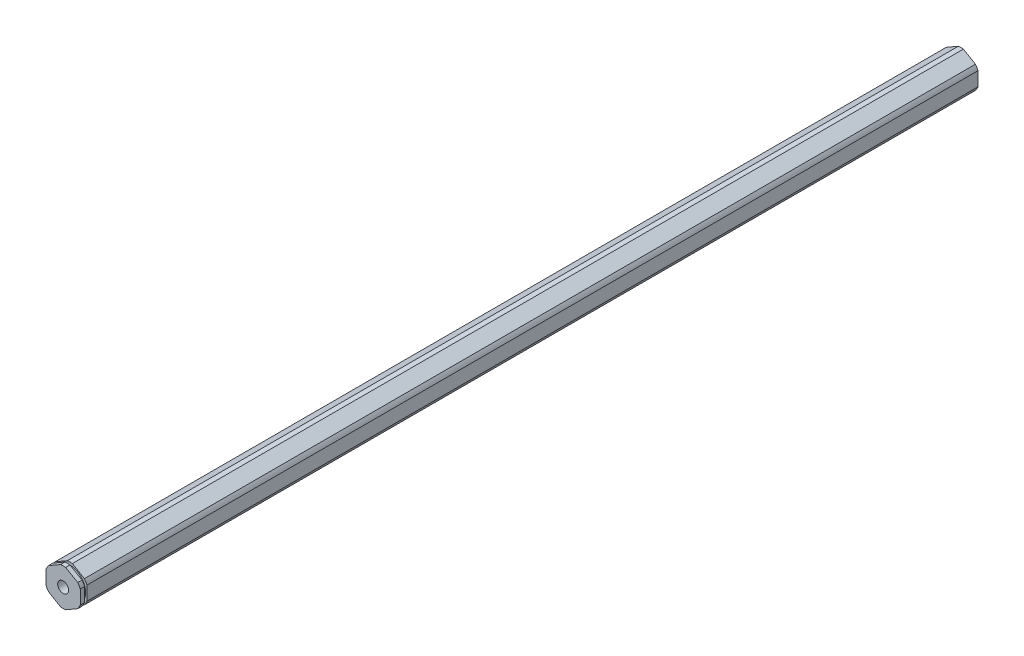
ISO-10303-21;
HEADER;
FILE_DESCRIPTION(('STEP AP214'),'2;1');
FILE_NAME('part.step','',(''),(''),'','','');
FILE_SCHEMA(('AUTOMOTIVE_DESIGN { 1 0 10303 214 1 1 1 1 }'));
ENDSEC;
DATA;
#1=APPLICATION_CONTEXT('core data for automotive mechanical design processes');
#2=APPLICATION_PROTOCOL_DEFINITION('international standard','automotive_design',2000,#1);
#3=PRODUCT_CONTEXT('',#1,'mechanical');
#4=PRODUCT('Part','Part','',(#3));
#5=PRODUCT_RELATED_PRODUCT_CATEGORY('part','',(#4));
#6=PRODUCT_DEFINITION_FORMATION('','',#4);
#7=PRODUCT_DEFINITION_CONTEXT('part definition',#1,'design');
#8=PRODUCT_DEFINITION('design','',#6,#7);
#9=PRODUCT_DEFINITION_SHAPE('','',#8);
#10=(LENGTH_UNIT() NAMED_UNIT(*) SI_UNIT(.MILLI.,.METRE.));
#11=(NAMED_UNIT(*) PLANE_ANGLE_UNIT() SI_UNIT($,.RADIAN.));
#12=(NAMED_UNIT(*) SI_UNIT($,.STERADIAN.) SOLID_ANGLE_UNIT());
#13=UNCERTAINTY_MEASURE_WITH_UNIT(LENGTH_MEASURE(1.E-05),#10,'distance_accuracy_value','');
#14=(GEOMETRIC_REPRESENTATION_CONTEXT(3) GLOBAL_UNCERTAINTY_ASSIGNED_CONTEXT((#13)) GLOBAL_UNIT_ASSIGNED_CONTEXT((#10,
#11,#12)) REPRESENTATION_CONTEXT('',''));
#15=CARTESIAN_POINT('',(0.,0.,0.));
#16=DIRECTION('',(0.,0.,1.));
#17=DIRECTION('',(1.,0.,0.));
#18=AXIS2_PLACEMENT_3D('',#15,#16,#17);
#19=CARTESIAN_POINT('',(6.35,0.,166.33825));
#20=DIRECTION('',(-1.,0.,0.));
#21=DIRECTION('',(0.,-1.,0.));
#22=AXIS2_PLACEMENT_3D('',#19,#20,#21);
#23=PLANE('',#22);
#24=DIRECTION('',(0.,-1.,0.));
#25=VECTOR('',#24,1.);
#26=CARTESIAN_POINT('',(6.35,0.,164.75075));
#27=LINE('',#26,#25);
#28=CARTESIAN_POINT('',(6.35,2.59030191290513,164.75075));
#29=VERTEX_POINT('',#28);
#30=CARTESIAN_POINT('',(6.35,-2.59030191290513,164.75075));
#31=VERTEX_POINT('',#30);
#32=EDGE_CURVE('E74',#29,#31,#27,.T.);
#33=ORIENTED_EDGE('',*,*,#32,.F.);
#34=DIRECTION('',(0.,0.,-1.));
#35=VECTOR('',#34,1.);
#36=CARTESIAN_POINT('',(6.35,2.59030191290513,166.33825));
#37=LINE('',#36,#35);
#38=CARTESIAN_POINT('',(6.35,2.59030191290513,166.33825));
#39=VERTEX_POINT('',#38);
#40=EDGE_CURVE('E242',#39,#29,#37,.T.);
#41=ORIENTED_EDGE('',*,*,#40,.F.);
#42=DIRECTION('',(0.,1.,0.));
#43=VECTOR('',#42,1.);
#44=CARTESIAN_POINT('',(6.35,0.,166.33825));
#45=LINE('',#44,#43);
#46=CARTESIAN_POINT('',(6.35,-2.59030191290513,166.33825));
#47=VERTEX_POINT('',#46);
#48=EDGE_CURVE('E330',#47,#39,#45,.T.);
#49=ORIENTED_EDGE('',*,*,#48,.F.);
#50=DIRECTION('',(0.,0.,-1.));
#51=VECTOR('',#50,1.);
#52=CARTESIAN_POINT('',(6.35,-2.59030191290513,166.33825));
#53=LINE('',#52,#51);
#54=EDGE_CURVE('E285',#47,#31,#53,.T.);
#55=ORIENTED_EDGE('',*,*,#54,.T.);
#56=EDGE_LOOP('',(#33,#41,#49,#55));
#57=FACE_BOUND('',#56,.T.);
#58=ADVANCED_FACE('F53',(#57),#23,.F.);
#59=CARTESIAN_POINT('',(0.,0.,166.33825));
#60=DIRECTION('',(0.,0.,-1.));
#61=DIRECTION('',(-1.,0.,0.));
#62=AXIS2_PLACEMENT_3D('',#59,#60,#61);
#63=CYLINDRICAL_SURFACE('',#62,6.858);
#64=CARTESIAN_POINT('',(0.,0.,164.75075));
#65=DIRECTION('',(0.,0.,1.));
#66=DIRECTION('',(1.,0.,0.));
#67=AXIS2_PLACEMENT_3D('',#64,#65,#66);
#68=CIRCLE('',#67,6.858);
#69=CARTESIAN_POINT('',(5.41826726004727,4.20411035757862,164.75075));
#70=VERTEX_POINT('',#69);
#71=EDGE_CURVE('E367',#29,#70,#68,.T.);
#72=ORIENTED_EDGE('',*,*,#71,.T.);
#73=DIRECTION('',(0.,0.,-1.));
#74=VECTOR('',#73,1.);
#75=CARTESIAN_POINT('',(5.41826726004727,4.20411035757862,166.33825));
#76=LINE('',#75,#74);
#77=CARTESIAN_POINT('',(5.41826726004727,4.20411035757862,166.33825));
#78=VERTEX_POINT('',#77);
#79=EDGE_CURVE('E243',#78,#70,#76,.T.);
#80=ORIENTED_EDGE('',*,*,#79,.F.);
#81=CARTESIAN_POINT('',(0.,0.,166.33825));
#82=DIRECTION('',(0.,0.,1.));
#83=DIRECTION('',(1.,0.,0.));
#84=AXIS2_PLACEMENT_3D('',#81,#82,#83);
#85=CIRCLE('',#84,6.858);
#86=EDGE_CURVE('E328',#39,#78,#85,.T.);
#87=ORIENTED_EDGE('',*,*,#86,.F.);
#88=ORIENTED_EDGE('',*,*,#40,.T.);
#89=EDGE_LOOP('',(#72,#80,#87,#88));
#90=FACE_BOUND('',#89,.T.);
#91=ADVANCED_FACE('F456',(#90),#63,.T.);
#92=CARTESIAN_POINT('',(3.175,5.49926131403119,166.33825));
#93=DIRECTION('',(-0.5,-0.866025403784439,0.));
#94=DIRECTION('',(0.866025403784439,-0.5,0.));
#95=AXIS2_PLACEMENT_3D('',#92,#93,#94);
#96=PLANE('',#95);
#97=DIRECTION('',(0.866025403784439,-0.5,0.));
#98=VECTOR('',#97,1.);
#99=CARTESIAN_POINT('',(3.175,5.49926131403119,164.75075));
#100=LINE('',#99,#98);
#101=CARTESIAN_POINT('',(0.931732739952733,6.79441227048375,164.75075));
#102=VERTEX_POINT('',#101);
#103=EDGE_CURVE('E345',#102,#70,#100,.T.);
#104=ORIENTED_EDGE('',*,*,#103,.F.);
#105=DIRECTION('',(0.,0.,-1.));
#106=VECTOR('',#105,1.);
#107=CARTESIAN_POINT('',(0.931732739952733,6.79441227048375,166.33825));
#108=LINE('',#107,#106);
#109=CARTESIAN_POINT('',(0.931732739952733,6.79441227048375,166.33825));
#110=VERTEX_POINT('',#109);
#111=EDGE_CURVE('E249',#110,#102,#108,.T.);
#112=ORIENTED_EDGE('',*,*,#111,.F.);
#113=DIRECTION('',(-0.866025403784439,0.5,0.));
#114=VECTOR('',#113,1.);
#115=CARTESIAN_POINT('',(3.175,5.49926131403119,166.33825));
#116=LINE('',#115,#114);
#117=EDGE_CURVE('E326',#78,#110,#116,.T.);
#118=ORIENTED_EDGE('',*,*,#117,.F.);
#119=ORIENTED_EDGE('',*,*,#79,.T.);
#120=EDGE_LOOP('',(#104,#112,#118,#119));
#121=FACE_BOUND('',#120,.T.);
#122=ADVANCED_FACE('F466',(#121),#96,.F.);
#123=CARTESIAN_POINT('',(-0.931732739952722,6.79441227048375,164.75075));
#124=VERTEX_POINT('',#123);
#125=EDGE_CURVE('E369',#102,#124,#68,.T.);
#126=ORIENTED_EDGE('',*,*,#125,.T.);
#127=DIRECTION('',(0.,0.,-1.));
#128=VECTOR('',#127,1.);
#129=CARTESIAN_POINT('',(-0.931732739952731,6.79441227048375,166.33825));
#130=LINE('',#129,#128);
#131=CARTESIAN_POINT('',(-0.931732739952731,6.79441227048375,166.33825));
#132=VERTEX_POINT('',#131);
#133=EDGE_CURVE('E253',#132,#124,#130,.T.);
#134=ORIENTED_EDGE('',*,*,#133,.F.);
#135=EDGE_CURVE('E325',#110,#132,#85,.T.);
#136=ORIENTED_EDGE('',*,*,#135,.F.);
#137=ORIENTED_EDGE('',*,*,#111,.T.);
#138=EDGE_LOOP('',(#126,#134,#136,#137));
#139=FACE_BOUND('',#138,.T.);
#140=ADVANCED_FACE('F471',(#139),#63,.T.);
#141=CARTESIAN_POINT('',(-3.175,5.49926131403119,166.33825));
#142=DIRECTION('',(0.5,-0.866025403784438,0.));
#143=DIRECTION('',(0.866025403784439,0.5,0.));
#144=AXIS2_PLACEMENT_3D('',#141,#142,#143);
#145=PLANE('',#144);
#146=DIRECTION('',(0.866025403784439,0.5,0.));
#147=VECTOR('',#146,1.);
#148=CARTESIAN_POINT('',(-3.175,5.49926131403119,164.75075));
#149=LINE('',#148,#147);
#150=CARTESIAN_POINT('',(-5.41826726004727,4.20411035757862,164.75075));
#151=VERTEX_POINT('',#150);
#152=EDGE_CURVE('E347',#151,#124,#149,.T.);
#153=ORIENTED_EDGE('',*,*,#152,.F.);
#154=DIRECTION('',(0.,0.,-1.));
#155=VECTOR('',#154,1.);
#156=CARTESIAN_POINT('',(-5.41826726004727,4.20411035757862,166.33825));
#157=LINE('',#156,#155);
#158=CARTESIAN_POINT('',(-5.41826726004727,4.20411035757862,166.33825));
#159=VERTEX_POINT('',#158);
#160=EDGE_CURVE('E257',#159,#151,#157,.T.);
#161=ORIENTED_EDGE('',*,*,#160,.F.);
#162=DIRECTION('',(-0.866025403784439,-0.5,0.));
#163=VECTOR('',#162,1.);
#164=CARTESIAN_POINT('',(-3.175,5.49926131403119,166.33825));
#165=LINE('',#164,#163);
#166=EDGE_CURVE('E323',#132,#159,#165,.T.);
#167=ORIENTED_EDGE('',*,*,#166,.F.);
#168=ORIENTED_EDGE('',*,*,#133,.T.);
#169=EDGE_LOOP('',(#153,#161,#167,#168));
#170=FACE_BOUND('',#169,.T.);
#171=ADVANCED_FACE('F477',(#170),#145,.F.);
#172=CARTESIAN_POINT('',(-6.35,2.59030191290514,164.75075));
#173=VERTEX_POINT('',#172);
#174=EDGE_CURVE('E375',#151,#173,#68,.T.);
#175=ORIENTED_EDGE('',*,*,#174,.T.);
#176=DIRECTION('',(0.,0.,-1.));
#177=VECTOR('',#176,1.);
#178=CARTESIAN_POINT('',(-6.35,2.59030191290514,166.33825));
#179=LINE('',#178,#177);
#180=CARTESIAN_POINT('',(-6.35,2.59030191290514,166.33825));
#181=VERTEX_POINT('',#180);
#182=EDGE_CURVE('E261',#181,#173,#179,.T.);
#183=ORIENTED_EDGE('',*,*,#182,.F.);
#184=EDGE_CURVE('E322',#159,#181,#85,.T.);
#185=ORIENTED_EDGE('',*,*,#184,.F.);
#186=ORIENTED_EDGE('',*,*,#160,.T.);
#187=EDGE_LOOP('',(#175,#183,#185,#186));
#188=FACE_BOUND('',#187,.T.);
#189=ADVANCED_FACE('F386',(#188),#63,.T.);
#190=CARTESIAN_POINT('',(-6.35,0.,166.33825));
#191=DIRECTION('',(1.,0.,0.));
#192=DIRECTION('',(0.,1.,0.));
#193=AXIS2_PLACEMENT_3D('',#190,#191,#192);
#194=PLANE('',#193);
#195=DIRECTION('',(0.,1.,0.));
#196=VECTOR('',#195,1.);
#197=CARTESIAN_POINT('',(-6.35,0.,164.75075));
#198=LINE('',#197,#196);
#199=CARTESIAN_POINT('',(-6.35,-2.59030191290514,164.75075));
#200=VERTEX_POINT('',#199);
#201=EDGE_CURVE('E349',#200,#173,#198,.T.);
#202=ORIENTED_EDGE('',*,*,#201,.F.);
#203=DIRECTION('',(0.,0.,-1.));
#204=VECTOR('',#203,1.);
#205=CARTESIAN_POINT('',(-6.35,-2.59030191290514,166.33825));
#206=LINE('',#205,#204);
#207=CARTESIAN_POINT('',(-6.35,-2.59030191290514,166.33825));
#208=VERTEX_POINT('',#207);
#209=EDGE_CURVE('E265',#208,#200,#206,.T.);
#210=ORIENTED_EDGE('',*,*,#209,.F.);
#211=DIRECTION('',(0.,-1.,0.));
#212=VECTOR('',#211,1.);
#213=CARTESIAN_POINT('',(-6.35,0.,166.33825));
#214=LINE('',#213,#212);
#215=EDGE_CURVE('E320',#181,#208,#214,.T.);
#216=ORIENTED_EDGE('',*,*,#215,.F.);
#217=ORIENTED_EDGE('',*,*,#182,.T.);
#218=EDGE_LOOP('',(#202,#210,#216,#217));
#219=FACE_BOUND('',#218,.T.);
#220=ADVANCED_FACE('F393',(#219),#194,.F.);
#221=CARTESIAN_POINT('',(-5.41826726004728,-4.20411035757861,164.75075));
#222=VERTEX_POINT('',#221);
#223=EDGE_CURVE('E377',#200,#222,#68,.T.);
#224=ORIENTED_EDGE('',*,*,#223,.T.);
#225=DIRECTION('',(0.,0.,-1.));
#226=VECTOR('',#225,1.);
#227=CARTESIAN_POINT('',(-5.41826726004728,-4.20411035757862,166.33825));
#228=LINE('',#227,#226);
#229=CARTESIAN_POINT('',(-5.41826726004728,-4.20411035757862,166.33825));
#230=VERTEX_POINT('',#229);
#231=EDGE_CURVE('E269',#230,#222,#228,.T.);
#232=ORIENTED_EDGE('',*,*,#231,.F.);
#233=EDGE_CURVE('E319',#208,#230,#85,.T.);
#234=ORIENTED_EDGE('',*,*,#233,.F.);
#235=ORIENTED_EDGE('',*,*,#209,.T.);
#236=EDGE_LOOP('',(#224,#232,#234,#235));
#237=FACE_BOUND('',#236,.T.);
#238=ADVANCED_FACE('F497',(#237),#63,.T.);
#239=CARTESIAN_POINT('',(-3.175,-5.49926131403118,166.33825));
#240=DIRECTION('',(0.5,0.866025403784439,0.));
#241=DIRECTION('',(-0.866025403784439,0.5,0.));
#242=AXIS2_PLACEMENT_3D('',#239,#240,#241);
#243=PLANE('',#242);
#244=DIRECTION('',(-0.866025403784439,0.5,0.));
#245=VECTOR('',#244,1.);
#246=CARTESIAN_POINT('',(-3.175,-5.49926131403118,164.75075));
#247=LINE('',#246,#245);
#248=CARTESIAN_POINT('',(-0.931732739952721,-6.79441227048375,164.75075));
#249=VERTEX_POINT('',#248);
#250=EDGE_CURVE('E351',#249,#222,#247,.T.);
#251=ORIENTED_EDGE('',*,*,#250,.F.);
#252=DIRECTION('',(0.,0.,-1.));
#253=VECTOR('',#252,1.);
#254=CARTESIAN_POINT('',(-0.931732739952721,-6.79441227048375,166.33825));
#255=LINE('',#254,#253);
#256=CARTESIAN_POINT('',(-0.931732739952721,-6.79441227048375,166.33825));
#257=VERTEX_POINT('',#256);
#258=EDGE_CURVE('E273',#257,#249,#255,.T.);
#259=ORIENTED_EDGE('',*,*,#258,.F.);
#260=DIRECTION('',(0.866025403784439,-0.5,0.));
#261=VECTOR('',#260,1.);
#262=CARTESIAN_POINT('',(-3.175,-5.49926131403118,166.33825));
#263=LINE('',#262,#261);
#264=EDGE_CURVE('E317',#230,#257,#263,.T.);
#265=ORIENTED_EDGE('',*,*,#264,.F.);
#266=ORIENTED_EDGE('',*,*,#231,.T.);
#267=EDGE_LOOP('',(#251,#259,#265,#266));
#268=FACE_BOUND('',#267,.T.);
#269=ADVANCED_FACE('F507',(#268),#243,.F.);
#270=CARTESIAN_POINT('',(0.931732739952728,-6.79441227048375,164.75075));
#271=VERTEX_POINT('',#270);
#272=EDGE_CURVE('E370',#249,#271,#68,.T.);
#273=ORIENTED_EDGE('',*,*,#272,.T.);
#274=DIRECTION('',(0.,0.,-1.));
#275=VECTOR('',#274,1.);
#276=CARTESIAN_POINT('',(0.931732739952731,-6.79441227048375,166.33825));
#277=LINE('',#276,#275);
#278=CARTESIAN_POINT('',(0.931732739952731,-6.79441227048375,166.33825));
#279=VERTEX_POINT('',#278);
#280=EDGE_CURVE('E277',#279,#271,#277,.T.);
#281=ORIENTED_EDGE('',*,*,#280,.F.);
#282=EDGE_CURVE('E316',#257,#279,#85,.T.);
#283=ORIENTED_EDGE('',*,*,#282,.F.);
#284=ORIENTED_EDGE('',*,*,#258,.T.);
#285=EDGE_LOOP('',(#273,#281,#283,#284));
#286=FACE_BOUND('',#285,.T.);
#287=ADVANCED_FACE('F455',(#286),#63,.T.);
#288=CARTESIAN_POINT('',(3.175,-5.49926131403118,166.33825));
#289=DIRECTION('',(-0.5,0.866025403784439,0.));
#290=DIRECTION('',(-0.866025403784439,-0.5,0.));
#291=AXIS2_PLACEMENT_3D('',#288,#289,#290);
#292=PLANE('',#291);
#293=DIRECTION('',(-0.866025403784439,-0.5,0.));
#294=VECTOR('',#293,1.);
#295=CARTESIAN_POINT('',(3.175,-5.49926131403118,164.75075));
#296=LINE('',#295,#294);
#297=CARTESIAN_POINT('',(5.41826726004727,-4.20411035757862,164.75075));
#298=VERTEX_POINT('',#297);
#299=EDGE_CURVE('E224',#298,#271,#296,.T.);
#300=ORIENTED_EDGE('',*,*,#299,.F.);
#301=DIRECTION('',(0.,0.,-1.));
#302=VECTOR('',#301,1.);
#303=CARTESIAN_POINT('',(5.41826726004727,-4.20411035757862,166.33825));
#304=LINE('',#303,#302);
#305=CARTESIAN_POINT('',(5.41826726004727,-4.20411035757862,166.33825));
#306=VERTEX_POINT('',#305);
#307=EDGE_CURVE('E281',#306,#298,#304,.T.);
#308=ORIENTED_EDGE('',*,*,#307,.F.);
#309=DIRECTION('',(0.866025403784439,0.5,0.));
#310=VECTOR('',#309,1.);
#311=CARTESIAN_POINT('',(3.175,-5.49926131403118,166.33825));
#312=LINE('',#311,#310);
#313=EDGE_CURVE('E313',#279,#306,#312,.T.);
#314=ORIENTED_EDGE('',*,*,#313,.F.);
#315=ORIENTED_EDGE('',*,*,#280,.T.);
#316=EDGE_LOOP('',(#300,#308,#314,#315));
#317=FACE_BOUND('',#316,.T.);
#318=ADVANCED_FACE('F448',(#317),#292,.F.);
#319=CARTESIAN_POINT('',(0.,0.,164.75075));
#320=DIRECTION('',(0.,0.,-1.));
#321=DIRECTION('',(-1.,0.,0.));
#322=AXIS2_PLACEMENT_3D('',#319,#320,#321);
#323=CIRCLE('',#322,6.858);
#324=EDGE_CURVE('E11',#31,#298,#323,.T.);
#325=ORIENTED_EDGE('',*,*,#324,.F.);
#326=ORIENTED_EDGE('',*,*,#54,.F.);
#327=EDGE_CURVE('E315',#306,#47,#85,.T.);
#328=ORIENTED_EDGE('',*,*,#327,.F.);
#329=ORIENTED_EDGE('',*,*,#307,.T.);
#330=EDGE_LOOP('',(#325,#326,#328,#329));
#331=FACE_BOUND('',#330,.T.);
#332=ADVANCED_FACE('F454',(#331),#63,.T.);
#333=CARTESIAN_POINT('',(0.,0.,166.33825));
#334=DIRECTION('',(0.,0.,1.));
#335=DIRECTION('',(1.,0.,0.));
#336=AXIS2_PLACEMENT_3D('',#333,#334,#335);
#337=PLANE('',#336);
#338=CARTESIAN_POINT('',(0.,0.,166.33825));
#339=DIRECTION('',(0.,0.,1.));
#340=DIRECTION('',(1.,0.,0.));
#341=AXIS2_PLACEMENT_3D('',#338,#339,#340);
#342=CIRCLE('',#341,2.01929999999999);
#343=CARTESIAN_POINT('',(2.01929999999999,0.,166.33825));
#344=VERTEX_POINT('',#343);
#345=EDGE_CURVE('E341',#344,#344,#342,.T.);
#346=ORIENTED_EDGE('',*,*,#345,.F.);
#347=EDGE_LOOP('',(#346));
#348=FACE_BOUND('',#347,.T.);
#349=ORIENTED_EDGE('',*,*,#48,.T.);
#350=ORIENTED_EDGE('',*,*,#86,.T.);
#351=ORIENTED_EDGE('',*,*,#117,.T.);
#352=ORIENTED_EDGE('',*,*,#135,.T.);
#353=ORIENTED_EDGE('',*,*,#166,.T.);
#354=ORIENTED_EDGE('',*,*,#184,.T.);
#355=ORIENTED_EDGE('',*,*,#215,.T.);
#356=ORIENTED_EDGE('',*,*,#233,.T.);
#357=ORIENTED_EDGE('',*,*,#264,.T.);
#358=ORIENTED_EDGE('',*,*,#282,.T.);
#359=ORIENTED_EDGE('',*,*,#313,.T.);
#360=ORIENTED_EDGE('',*,*,#327,.T.);
#361=EDGE_LOOP('',(#349,#350,#351,#352,#353,#354,#355,#356,#357,#358,#359,#360));
#362=FACE_BOUND('',#361,.T.);
#363=ADVANCED_FACE('F397',(#348,#362),#337,.T.);
#364=CARTESIAN_POINT('',(0.,0.,149.99081));
#365=DIRECTION('',(0.,0.,1.));
#366=DIRECTION('',(1.,0.,0.));
#367=AXIS2_PLACEMENT_3D('',#364,#365,#366);
#368=CONICAL_SURFACE('',#367,2.01929999999999,1.02974425867665);
#369=CARTESIAN_POINT('',(0.,0.,148.777492151998));
#370=VERTEX_POINT('',#369);
#371=VERTEX_LOOP('',#370);
#372=FACE_BOUND('',#371,.T.);
#373=CARTESIAN_POINT('',(0.,0.,149.99081));
#374=DIRECTION('',(0.,0.,1.));
#375=DIRECTION('',(1.,0.,0.));
#376=AXIS2_PLACEMENT_3D('',#373,#374,#375);
#377=CIRCLE('',#376,2.01929999999999);
#378=CARTESIAN_POINT('',(2.01929999999999,0.,149.99081));
#379=VERTEX_POINT('',#378);
#380=EDGE_CURVE('E338',#379,#379,#377,.T.);
#381=ORIENTED_EDGE('',*,*,#380,.T.);
#382=EDGE_LOOP('',(#381));
#383=FACE_BOUND('',#382,.T.);
#384=ADVANCED_FACE('F575',(#372,#383),#368,.F.);
#385=CARTESIAN_POINT('',(0.,0.,166.33825));
#386=DIRECTION('',(0.,0.,1.));
#387=DIRECTION('',(1.,0.,0.));
#388=AXIS2_PLACEMENT_3D('',#385,#386,#387);
#389=CYLINDRICAL_SURFACE('',#388,2.01929999999999);
#390=ORIENTED_EDGE('',*,*,#380,.F.);
#391=EDGE_LOOP('',(#390));
#392=FACE_BOUND('',#391,.T.);
#393=ORIENTED_EDGE('',*,*,#345,.T.);
#394=EDGE_LOOP('',(#393));
#395=FACE_BOUND('',#394,.T.);
#396=ADVANCED_FACE('F541',(#392,#395),#389,.F.);
#397=CARTESIAN_POINT('',(0.,6.858,164.75075));
#398=DIRECTION('',(0.,0.,-1.));
#399=DIRECTION('',(-1.,0.,0.));
#400=AXIS2_PLACEMENT_3D('',#397,#398,#399);
#401=PLANE('',#400);
#402=CARTESIAN_POINT('',(0.,0.,164.75075));
#403=DIRECTION('',(0.,0.,1.));
#404=DIRECTION('',(1.,0.,0.));
#405=AXIS2_PLACEMENT_3D('',#402,#403,#404);
#406=CIRCLE('',#405,5.8547);
#407=CARTESIAN_POINT('',(5.8547,0.,164.75075));
#408=VERTEX_POINT('',#407);
#409=EDGE_CURVE('E362',#408,#408,#406,.T.);
#410=ORIENTED_EDGE('',*,*,#409,.T.);
#411=EDGE_LOOP('',(#410));
#412=FACE_BOUND('',#411,.T.);
#413=ORIENTED_EDGE('',*,*,#32,.T.);
#414=ORIENTED_EDGE('',*,*,#324,.T.);
#415=ORIENTED_EDGE('',*,*,#299,.T.);
#416=ORIENTED_EDGE('',*,*,#272,.F.);
#417=ORIENTED_EDGE('',*,*,#250,.T.);
#418=ORIENTED_EDGE('',*,*,#223,.F.);
#419=ORIENTED_EDGE('',*,*,#201,.T.);
#420=ORIENTED_EDGE('',*,*,#174,.F.);
#421=ORIENTED_EDGE('',*,*,#152,.T.);
#422=ORIENTED_EDGE('',*,*,#125,.F.);
#423=ORIENTED_EDGE('',*,*,#103,.T.);
#424=ORIENTED_EDGE('',*,*,#71,.F.);
#425=EDGE_LOOP('',(#413,#414,#415,#416,#417,#418,#419,#420,#421,#422,#423,#424));
#426=FACE_BOUND('',#425,.T.);
#427=ADVANCED_FACE('F537',(#412,#426),#401,.T.);
#428=CARTESIAN_POINT('',(0.,6.858,163.86175));
#429=DIRECTION('',(0.,0.,1.));
#430=DIRECTION('',(1.,0.,0.));
#431=AXIS2_PLACEMENT_3D('',#428,#429,#430);
#432=PLANE('',#431);
#433=CARTESIAN_POINT('',(0.,0.,163.86175));
#434=DIRECTION('',(0.,0.,1.));
#435=DIRECTION('',(1.,0.,0.));
#436=AXIS2_PLACEMENT_3D('',#433,#434,#435);
#437=CIRCLE('',#436,5.8547);
#438=CARTESIAN_POINT('',(5.8547,0.,163.86175));
#439=VERTEX_POINT('',#438);
#440=EDGE_CURVE('E234',#439,#439,#437,.T.);
#441=ORIENTED_EDGE('',*,*,#440,.F.);
#442=EDGE_LOOP('',(#441));
#443=FACE_BOUND('',#442,.T.);
#444=DIRECTION('',(0.,1.,0.));
#445=VECTOR('',#444,1.);
#446=CARTESIAN_POINT('',(6.35,0.,163.86175));
#447=LINE('',#446,#445);
#448=CARTESIAN_POINT('',(6.35,-2.59030191290513,163.86175));
#449=VERTEX_POINT('',#448);
#450=CARTESIAN_POINT('',(6.35,2.59030191290513,163.86175));
#451=VERTEX_POINT('',#450);
#452=EDGE_CURVE('E216',#449,#451,#447,.T.);
#453=ORIENTED_EDGE('',*,*,#452,.T.);
#454=CARTESIAN_POINT('',(0.,0.,163.86175));
#455=DIRECTION('',(0.,0.,1.));
#456=DIRECTION('',(1.,0.,0.));
#457=AXIS2_PLACEMENT_3D('',#454,#455,#456);
#458=CIRCLE('',#457,6.858);
#459=CARTESIAN_POINT('',(5.41826726004727,4.20411035757862,163.86175));
#460=VERTEX_POINT('',#459);
#461=EDGE_CURVE('E219',#451,#460,#458,.T.);
#462=ORIENTED_EDGE('',*,*,#461,.T.);
#463=DIRECTION('',(-0.866025403784439,0.5,0.));
#464=VECTOR('',#463,1.);
#465=CARTESIAN_POINT('',(3.175,5.49926131403119,163.86175));
#466=LINE('',#465,#464);
#467=CARTESIAN_POINT('',(0.931732739952733,6.79441227048375,163.86175));
#468=VERTEX_POINT('',#467);
#469=EDGE_CURVE('E225',#460,#468,#466,.T.);
#470=ORIENTED_EDGE('',*,*,#469,.T.);
#471=CARTESIAN_POINT('',(-0.931732739952722,6.79441227048375,163.86175));
#472=VERTEX_POINT('',#471);
#473=EDGE_CURVE('E235',#468,#472,#458,.T.);
#474=ORIENTED_EDGE('',*,*,#473,.T.);
#475=DIRECTION('',(-0.866025403784439,-0.5,0.));
#476=VECTOR('',#475,1.);
#477=CARTESIAN_POINT('',(-3.175,5.49926131403119,163.86175));
#478=LINE('',#477,#476);
#479=CARTESIAN_POINT('',(-5.41826726004727,4.20411035757862,163.86175));
#480=VERTEX_POINT('',#479);
#481=EDGE_CURVE('E355',#472,#480,#478,.T.);
#482=ORIENTED_EDGE('',*,*,#481,.T.);
#483=CARTESIAN_POINT('',(-6.35,2.59030191290514,163.86175));
#484=VERTEX_POINT('',#483);
#485=EDGE_CURVE('E422',#480,#484,#458,.T.);
#486=ORIENTED_EDGE('',*,*,#485,.T.);
#487=DIRECTION('',(0.,-1.,0.));
#488=VECTOR('',#487,1.);
#489=CARTESIAN_POINT('',(-6.35,0.,163.86175));
#490=LINE('',#489,#488);
#491=CARTESIAN_POINT('',(-6.35,-2.59030191290514,163.86175));
#492=VERTEX_POINT('',#491);
#493=EDGE_CURVE('E357',#484,#492,#490,.T.);
#494=ORIENTED_EDGE('',*,*,#493,.T.);
#495=CARTESIAN_POINT('',(-5.41826726004728,-4.20411035757861,163.86175));
#496=VERTEX_POINT('',#495);
#497=EDGE_CURVE('E373',#492,#496,#458,.T.);
#498=ORIENTED_EDGE('',*,*,#497,.T.);
#499=DIRECTION('',(0.866025403784439,-0.5,0.));
#500=VECTOR('',#499,1.);
#501=CARTESIAN_POINT('',(-3.175,-5.49926131403118,163.86175));
#502=LINE('',#501,#500);
#503=CARTESIAN_POINT('',(-0.931732739952721,-6.79441227048375,163.86175));
#504=VERTEX_POINT('',#503);
#505=EDGE_CURVE('E359',#496,#504,#502,.T.);
#506=ORIENTED_EDGE('',*,*,#505,.T.);
#507=CARTESIAN_POINT('',(0.931732739952728,-6.79441227048375,163.86175));
#508=VERTEX_POINT('',#507);
#509=EDGE_CURVE('E237',#504,#508,#458,.T.);
#510=ORIENTED_EDGE('',*,*,#509,.T.);
#511=DIRECTION('',(0.866025403784439,0.5,0.));
#512=VECTOR('',#511,1.);
#513=CARTESIAN_POINT('',(3.175,-5.49926131403118,163.86175));
#514=LINE('',#513,#512);
#515=CARTESIAN_POINT('',(5.41826726004727,-4.20411035757862,163.86175));
#516=VERTEX_POINT('',#515);
#517=EDGE_CURVE('E67',#508,#516,#514,.T.);
#518=ORIENTED_EDGE('',*,*,#517,.T.);
#519=CARTESIAN_POINT('',(0.,0.,163.86175));
#520=DIRECTION('',(0.,0.,1.));
#521=DIRECTION('',(1.,0.,0.));
#522=AXIS2_PLACEMENT_3D('',#519,#520,#521);
#523=CIRCLE('',#522,6.858);
#524=EDGE_CURVE('E60',#516,#449,#523,.T.);
#525=ORIENTED_EDGE('',*,*,#524,.T.);
#526=EDGE_LOOP('',(#453,#462,#470,#474,#482,#486,#494,#498,#506,#510,#518,#525));
#527=FACE_BOUND('',#526,.T.);
#528=ADVANCED_FACE('F218',(#443,#527),#432,.T.);
#529=CARTESIAN_POINT('',(0.,0.,165.047176272324));
#530=DIRECTION('',(0.,0.,1.));
#531=DIRECTION('',(1.,0.,0.));
#532=AXIS2_PLACEMENT_3D('',#529,#530,#531);
#533=CYLINDRICAL_SURFACE('',#532,5.8547);
#534=ORIENTED_EDGE('',*,*,#440,.T.);
#535=EDGE_LOOP('',(#534));
#536=FACE_BOUND('',#535,.T.);
#537=ORIENTED_EDGE('',*,*,#409,.F.);
#538=EDGE_LOOP('',(#537));
#539=FACE_BOUND('',#538,.T.);
#540=ADVANCED_FACE('F551',(#536,#539),#533,.T.);
#541=CARTESIAN_POINT('',(0.,0.,-149.99081));
#542=DIRECTION('',(0.,0.,-1.));
#543=DIRECTION('',(-1.,0.,0.));
#544=AXIS2_PLACEMENT_3D('',#541,#542,#543);
#545=CONICAL_SURFACE('',#544,2.01929999999999,1.02974425867665);
#546=CARTESIAN_POINT('',(0.,0.,-148.777492151998));
#547=VERTEX_POINT('',#546);
#548=VERTEX_LOOP('',#547);
#549=FACE_BOUND('',#548,.T.);
#550=CARTESIAN_POINT('',(0.,0.,-149.99081));
#551=DIRECTION('',(0.,0.,-1.));
#552=DIRECTION('',(-1.,0.,0.));
#553=AXIS2_PLACEMENT_3D('',#550,#551,#552);
#554=CIRCLE('',#553,2.01929999999999);
#555=CARTESIAN_POINT('',(-2.01929999999999,0.,-149.99081));
#556=VERTEX_POINT('',#555);
#557=EDGE_CURVE('E312',#556,#556,#554,.T.);
#558=ORIENTED_EDGE('',*,*,#557,.T.);
#559=EDGE_LOOP('',(#558));
#560=FACE_BOUND('',#559,.T.);
#561=ADVANCED_FACE('F559',(#549,#560),#545,.F.);
#562=CARTESIAN_POINT('',(0.,0.,-166.33825));
#563=DIRECTION('',(0.,0.,-1.));
#564=DIRECTION('',(-1.,0.,0.));
#565=AXIS2_PLACEMENT_3D('',#562,#563,#564);
#566=CYLINDRICAL_SURFACE('',#565,2.01929999999999);
#567=ORIENTED_EDGE('',*,*,#557,.F.);
#568=EDGE_LOOP('',(#567));
#569=FACE_BOUND('',#568,.T.);
#570=CARTESIAN_POINT('',(0.,0.,-166.33825));
#571=DIRECTION('',(0.,0.,-1.));
#572=DIRECTION('',(-1.,0.,0.));
#573=AXIS2_PLACEMENT_3D('',#570,#571,#572);
#574=CIRCLE('',#573,2.01929999999999);
#575=CARTESIAN_POINT('',(-2.01929999999999,0.,-166.33825));
#576=VERTEX_POINT('',#575);
#577=EDGE_CURVE('E335',#576,#576,#574,.T.);
#578=ORIENTED_EDGE('',*,*,#577,.T.);
#579=EDGE_LOOP('',(#578));
#580=FACE_BOUND('',#579,.T.);
#581=ADVANCED_FACE('F589',(#569,#580),#566,.F.);
#582=CARTESIAN_POINT('',(0.,0.,-166.33825));
#583=DIRECTION('',(0.,0.,1.));
#584=DIRECTION('',(1.,0.,0.));
#585=AXIS2_PLACEMENT_3D('',#582,#583,#584);
#586=PLANE('',#585);
#587=ORIENTED_EDGE('',*,*,#577,.F.);
#588=EDGE_LOOP('',(#587));
#589=FACE_BOUND('',#588,.T.);
#590=DIRECTION('',(0.,1.,0.));
#591=VECTOR('',#590,1.);
#592=CARTESIAN_POINT('',(6.35,0.,-166.33825));
#593=LINE('',#592,#591);
#594=CARTESIAN_POINT('',(6.35,-2.59030191290513,-166.33825));
#595=VERTEX_POINT('',#594);
#596=CARTESIAN_POINT('',(6.35,2.59030191290513,-166.33825));
#597=VERTEX_POINT('',#596);
#598=EDGE_CURVE('E241',#595,#597,#593,.T.);
#599=ORIENTED_EDGE('',*,*,#598,.F.);
#600=CARTESIAN_POINT('',(0.,0.,-166.33825));
#601=DIRECTION('',(0.,0.,1.));
#602=DIRECTION('',(1.,0.,0.));
#603=AXIS2_PLACEMENT_3D('',#600,#601,#602);
#604=CIRCLE('',#603,6.858);
#605=CARTESIAN_POINT('',(5.41826726004727,-4.20411035757862,-166.33825));
#606=VERTEX_POINT('',#605);
#607=EDGE_CURVE('E292',#606,#595,#604,.T.);
#608=ORIENTED_EDGE('',*,*,#607,.F.);
#609=DIRECTION('',(0.866025403784439,0.5,0.));
#610=VECTOR('',#609,1.);
#611=CARTESIAN_POINT('',(3.175,-5.49926131403118,-166.33825));
#612=LINE('',#611,#610);
#613=CARTESIAN_POINT('',(0.931732739952731,-6.79441227048375,-166.33825));
#614=VERTEX_POINT('',#613);
#615=EDGE_CURVE('E289',#614,#606,#612,.T.);
#616=ORIENTED_EDGE('',*,*,#615,.F.);
#617=CARTESIAN_POINT('',(-0.931732739952721,-6.79441227048375,-166.33825));
#618=VERTEX_POINT('',#617);
#619=EDGE_CURVE('E293',#618,#614,#604,.T.);
#620=ORIENTED_EDGE('',*,*,#619,.F.);
#621=DIRECTION('',(0.866025403784439,-0.5,0.));
#622=VECTOR('',#621,1.);
#623=CARTESIAN_POINT('',(-3.175,-5.49926131403118,-166.33825));
#624=LINE('',#623,#622);
#625=CARTESIAN_POINT('',(-5.41826726004728,-4.20411035757862,-166.33825));
#626=VERTEX_POINT('',#625);
#627=EDGE_CURVE('E294',#626,#618,#624,.T.);
#628=ORIENTED_EDGE('',*,*,#627,.F.);
#629=CARTESIAN_POINT('',(-6.35,-2.59030191290514,-166.33825));
#630=VERTEX_POINT('',#629);
#631=EDGE_CURVE('E297',#630,#626,#604,.T.);
#632=ORIENTED_EDGE('',*,*,#631,.F.);
#633=DIRECTION('',(0.,-1.,0.));
#634=VECTOR('',#633,1.);
#635=CARTESIAN_POINT('',(-6.35,0.,-166.33825));
#636=LINE('',#635,#634);
#637=CARTESIAN_POINT('',(-6.35,2.59030191290514,-166.33825));
#638=VERTEX_POINT('',#637);
#639=EDGE_CURVE('E298',#638,#630,#636,.T.);
#640=ORIENTED_EDGE('',*,*,#639,.F.);
#641=CARTESIAN_POINT('',(-5.41826726004727,4.20411035757862,-166.33825));
#642=VERTEX_POINT('',#641);
#643=EDGE_CURVE('E301',#642,#638,#604,.T.);
#644=ORIENTED_EDGE('',*,*,#643,.F.);
#645=DIRECTION('',(-0.866025403784439,-0.5,0.));
#646=VECTOR('',#645,1.);
#647=CARTESIAN_POINT('',(-3.175,5.49926131403119,-166.33825));
#648=LINE('',#647,#646);
#649=CARTESIAN_POINT('',(-0.931732739952731,6.79441227048375,-166.33825));
#650=VERTEX_POINT('',#649);
#651=EDGE_CURVE('E302',#650,#642,#648,.T.);
#652=ORIENTED_EDGE('',*,*,#651,.F.);
#653=CARTESIAN_POINT('',(0.931732739952733,6.79441227048375,-166.33825));
#654=VERTEX_POINT('',#653);
#655=EDGE_CURVE('E305',#654,#650,#604,.T.);
#656=ORIENTED_EDGE('',*,*,#655,.F.);
#657=DIRECTION('',(-0.866025403784439,0.5,0.));
#658=VECTOR('',#657,1.);
#659=CARTESIAN_POINT('',(3.175,5.49926131403119,-166.33825));
#660=LINE('',#659,#658);
#661=CARTESIAN_POINT('',(5.41826726004727,4.20411035757862,-166.33825));
#662=VERTEX_POINT('',#661);
#663=EDGE_CURVE('E306',#662,#654,#660,.T.);
#664=ORIENTED_EDGE('',*,*,#663,.F.);
#665=EDGE_CURVE('E309',#597,#662,#604,.T.);
#666=ORIENTED_EDGE('',*,*,#665,.F.);
#667=EDGE_LOOP('',(#599,#608,#616,#620,#628,#632,#640,#644,#652,#656,#664,#666));
#668=FACE_BOUND('',#667,.T.);
#669=ADVANCED_FACE('F409',(#589,#668),#586,.F.);
#670=ORIENTED_EDGE('',*,*,#524,.F.);
#671=EDGE_CURVE('E284',#516,#606,#304,.T.);
#672=ORIENTED_EDGE('',*,*,#671,.T.);
#673=ORIENTED_EDGE('',*,*,#607,.T.);
#674=EDGE_CURVE('E288',#449,#595,#53,.T.);
#675=ORIENTED_EDGE('',*,*,#674,.F.);
#676=EDGE_LOOP('',(#670,#672,#673,#675));
#677=FACE_BOUND('',#676,.T.);
#678=ADVANCED_FACE('F405',(#677),#63,.T.);
#679=ORIENTED_EDGE('',*,*,#517,.F.);
#680=EDGE_CURVE('E280',#508,#614,#277,.T.);
#681=ORIENTED_EDGE('',*,*,#680,.T.);
#682=ORIENTED_EDGE('',*,*,#615,.T.);
#683=ORIENTED_EDGE('',*,*,#671,.F.);
#684=EDGE_LOOP('',(#679,#681,#682,#683));
#685=FACE_BOUND('',#684,.T.);
#686=ADVANCED_FACE('F445',(#685),#292,.F.);
#687=ORIENTED_EDGE('',*,*,#509,.F.);
#688=EDGE_CURVE('E276',#504,#618,#255,.T.);
#689=ORIENTED_EDGE('',*,*,#688,.T.);
#690=ORIENTED_EDGE('',*,*,#619,.T.);
#691=ORIENTED_EDGE('',*,*,#680,.F.);
#692=EDGE_LOOP('',(#687,#689,#690,#691));
#693=FACE_BOUND('',#692,.T.);
#694=ADVANCED_FACE('F443',(#693),#63,.T.);
#695=ORIENTED_EDGE('',*,*,#505,.F.);
#696=EDGE_CURVE('E272',#496,#626,#228,.T.);
#697=ORIENTED_EDGE('',*,*,#696,.T.);
#698=ORIENTED_EDGE('',*,*,#627,.T.);
#699=ORIENTED_EDGE('',*,*,#688,.F.);
#700=EDGE_LOOP('',(#695,#697,#698,#699));
#701=FACE_BOUND('',#700,.T.);
#702=ADVANCED_FACE('F433',(#701),#243,.F.);
#703=ORIENTED_EDGE('',*,*,#497,.F.);
#704=EDGE_CURVE('E268',#492,#630,#206,.T.);
#705=ORIENTED_EDGE('',*,*,#704,.T.);
#706=ORIENTED_EDGE('',*,*,#631,.T.);
#707=ORIENTED_EDGE('',*,*,#696,.F.);
#708=EDGE_LOOP('',(#703,#705,#706,#707));
#709=FACE_BOUND('',#708,.T.);
#710=ADVANCED_FACE('F435',(#709),#63,.T.);
#711=ORIENTED_EDGE('',*,*,#493,.F.);
#712=EDGE_CURVE('E264',#484,#638,#179,.T.);
#713=ORIENTED_EDGE('',*,*,#712,.T.);
#714=ORIENTED_EDGE('',*,*,#639,.T.);
#715=ORIENTED_EDGE('',*,*,#704,.F.);
#716=EDGE_LOOP('',(#711,#713,#714,#715));
#717=FACE_BOUND('',#716,.T.);
#718=ADVANCED_FACE('F499',(#717),#194,.F.);
#719=ORIENTED_EDGE('',*,*,#485,.F.);
#720=EDGE_CURVE('E260',#480,#642,#157,.T.);
#721=ORIENTED_EDGE('',*,*,#720,.T.);
#722=ORIENTED_EDGE('',*,*,#643,.T.);
#723=ORIENTED_EDGE('',*,*,#712,.F.);
#724=EDGE_LOOP('',(#719,#721,#722,#723));
#725=FACE_BOUND('',#724,.T.);
#726=ADVANCED_FACE('F491',(#725),#63,.T.);
#727=ORIENTED_EDGE('',*,*,#481,.F.);
#728=EDGE_CURVE('E256',#472,#650,#130,.T.);
#729=ORIENTED_EDGE('',*,*,#728,.T.);
#730=ORIENTED_EDGE('',*,*,#651,.T.);
#731=ORIENTED_EDGE('',*,*,#720,.F.);
#732=EDGE_LOOP('',(#727,#729,#730,#731));
#733=FACE_BOUND('',#732,.T.);
#734=ADVANCED_FACE('F485',(#733),#145,.F.);
#735=ORIENTED_EDGE('',*,*,#473,.F.);
#736=EDGE_CURVE('E252',#468,#654,#108,.T.);
#737=ORIENTED_EDGE('',*,*,#736,.T.);
#738=ORIENTED_EDGE('',*,*,#655,.T.);
#739=ORIENTED_EDGE('',*,*,#728,.F.);
#740=EDGE_LOOP('',(#735,#737,#738,#739));
#741=FACE_BOUND('',#740,.T.);
#742=ADVANCED_FACE('F421',(#741),#63,.T.);
#743=ORIENTED_EDGE('',*,*,#469,.F.);
#744=EDGE_CURVE('E233',#460,#662,#76,.T.);
#745=ORIENTED_EDGE('',*,*,#744,.T.);
#746=ORIENTED_EDGE('',*,*,#663,.T.);
#747=ORIENTED_EDGE('',*,*,#736,.F.);
#748=EDGE_LOOP('',(#743,#745,#746,#747));
#749=FACE_BOUND('',#748,.T.);
#750=ADVANCED_FACE('F416',(#749),#96,.F.);
#751=ORIENTED_EDGE('',*,*,#461,.F.);
#752=EDGE_CURVE('E231',#451,#597,#37,.T.);
#753=ORIENTED_EDGE('',*,*,#752,.T.);
#754=ORIENTED_EDGE('',*,*,#665,.T.);
#755=ORIENTED_EDGE('',*,*,#744,.F.);
#756=EDGE_LOOP('',(#751,#753,#754,#755));
#757=FACE_BOUND('',#756,.T.);
#758=ADVANCED_FACE('F229',(#757),#63,.T.);
#759=ORIENTED_EDGE('',*,*,#452,.F.);
#760=ORIENTED_EDGE('',*,*,#674,.T.);
#761=ORIENTED_EDGE('',*,*,#598,.T.);
#762=ORIENTED_EDGE('',*,*,#752,.F.);
#763=EDGE_LOOP('',(#759,#760,#761,#762));
#764=FACE_BOUND('',#763,.T.);
#765=ADVANCED_FACE('F239',(#764),#23,.F.);
#766=CLOSED_SHELL('',(#58,#91,#122,#140,#171,#189,#220,#238,#269,#287,#318,#332,#363,#384,#396,
#427,#528,#540,#561,#581,#669,#678,#686,#694,#702,#710,#718,#726,#734,#742,#750,#758,#765));
#767=MANIFOLD_SOLID_BREP('B2',#766);
#768=ADVANCED_BREP_SHAPE_REPRESENTATION('',(#18,#767),#14);
#769=SHAPE_DEFINITION_REPRESENTATION(#9,#768);
ENDSEC;
END-ISO-10303-21;
